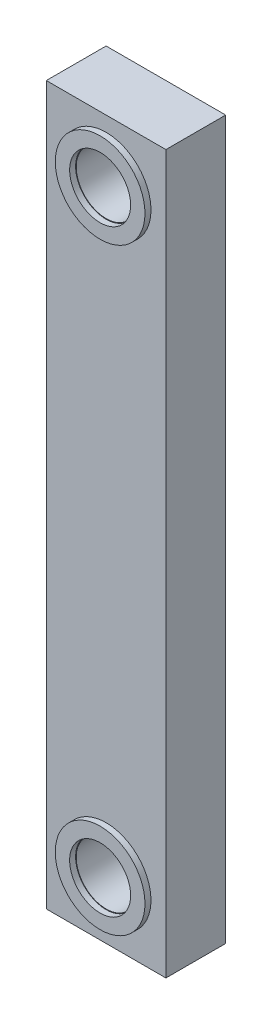
ISO-10303-21;
HEADER;
FILE_DESCRIPTION(('STEP AP214'),'2;1');
FILE_NAME('part.step','',(''),(''),'','','');
FILE_SCHEMA(('AUTOMOTIVE_DESIGN { 1 0 10303 214 1 1 1 1 }'));
ENDSEC;
DATA;
#1=APPLICATION_CONTEXT('core data for automotive mechanical design processes');
#2=APPLICATION_PROTOCOL_DEFINITION('international standard','automotive_design',2000,#1);
#3=PRODUCT_CONTEXT('',#1,'mechanical');
#4=PRODUCT('Part','Part','',(#3));
#5=PRODUCT_RELATED_PRODUCT_CATEGORY('part','',(#4));
#6=PRODUCT_DEFINITION_FORMATION('','',#4);
#7=PRODUCT_DEFINITION_CONTEXT('part definition',#1,'design');
#8=PRODUCT_DEFINITION('design','',#6,#7);
#9=PRODUCT_DEFINITION_SHAPE('','',#8);
#10=(LENGTH_UNIT() NAMED_UNIT(*) SI_UNIT(.MILLI.,.METRE.));
#11=(NAMED_UNIT(*) PLANE_ANGLE_UNIT() SI_UNIT($,.RADIAN.));
#12=(NAMED_UNIT(*) SI_UNIT($,.STERADIAN.) SOLID_ANGLE_UNIT());
#13=UNCERTAINTY_MEASURE_WITH_UNIT(LENGTH_MEASURE(1.E-05),#10,'distance_accuracy_value','');
#14=(GEOMETRIC_REPRESENTATION_CONTEXT(3) GLOBAL_UNCERTAINTY_ASSIGNED_CONTEXT((#13)) GLOBAL_UNIT_ASSIGNED_CONTEXT((#10,
#11,#12)) REPRESENTATION_CONTEXT('',''));
#15=CARTESIAN_POINT('',(0.,0.,0.));
#16=DIRECTION('',(0.,0.,1.));
#17=DIRECTION('',(1.,0.,0.));
#18=AXIS2_PLACEMENT_3D('',#15,#16,#17);
#19=CARTESIAN_POINT('',(0.,0.,10.));
#20=DIRECTION('',(1.,0.,0.));
#21=DIRECTION('',(0.,0.,-1.));
#22=AXIS2_PLACEMENT_3D('',#19,#20,#21);
#23=PLANE('',#22);
#24=DIRECTION('',(0.,-1.,0.));
#25=VECTOR('',#24,1.);
#26=CARTESIAN_POINT('',(0.,0.,0.));
#27=LINE('',#26,#25);
#28=CARTESIAN_POINT('',(0.,120.,0.));
#29=VERTEX_POINT('',#28);
#30=CARTESIAN_POINT('',(0.,0.,0.));
#31=VERTEX_POINT('',#30);
#32=EDGE_CURVE('E115',#29,#31,#27,.T.);
#33=ORIENTED_EDGE('',*,*,#32,.T.);
#34=DIRECTION('',(0.,0.,-1.));
#35=VECTOR('',#34,1.);
#36=CARTESIAN_POINT('',(0.,0.,10.));
#37=LINE('',#36,#35);
#38=CARTESIAN_POINT('',(0.,0.,10.));
#39=VERTEX_POINT('',#38);
#40=EDGE_CURVE('E104',#39,#31,#37,.T.);
#41=ORIENTED_EDGE('',*,*,#40,.F.);
#42=DIRECTION('',(0.,-1.,0.));
#43=VECTOR('',#42,1.);
#44=CARTESIAN_POINT('',(0.,0.,10.));
#45=LINE('',#44,#43);
#46=CARTESIAN_POINT('',(0.,120.,10.));
#47=VERTEX_POINT('',#46);
#48=EDGE_CURVE('E96',#47,#39,#45,.T.);
#49=ORIENTED_EDGE('',*,*,#48,.F.);
#50=DIRECTION('',(0.,0.,-1.));
#51=VECTOR('',#50,1.);
#52=CARTESIAN_POINT('',(0.,120.,10.));
#53=LINE('',#52,#51);
#54=EDGE_CURVE('E111',#47,#29,#53,.T.);
#55=ORIENTED_EDGE('',*,*,#54,.T.);
#56=EDGE_LOOP('',(#33,#41,#49,#55));
#57=FACE_BOUND('',#56,.T.);
#58=ADVANCED_FACE('F43',(#57),#23,.F.);
#59=CARTESIAN_POINT('',(0.,0.,10.));
#60=DIRECTION('',(0.,1.,0.));
#61=DIRECTION('',(0.,0.,1.));
#62=AXIS2_PLACEMENT_3D('',#59,#60,#61);
#63=PLANE('',#62);
#64=DIRECTION('',(1.,0.,0.));
#65=VECTOR('',#64,1.);
#66=CARTESIAN_POINT('',(0.,0.,0.));
#67=LINE('',#66,#65);
#68=CARTESIAN_POINT('',(20.,0.,0.));
#69=VERTEX_POINT('',#68);
#70=EDGE_CURVE('E102',#31,#69,#67,.T.);
#71=ORIENTED_EDGE('',*,*,#70,.T.);
#72=DIRECTION('',(0.,0.,-1.));
#73=VECTOR('',#72,1.);
#74=CARTESIAN_POINT('',(20.,0.,10.));
#75=LINE('',#74,#73);
#76=CARTESIAN_POINT('',(20.,0.,10.));
#77=VERTEX_POINT('',#76);
#78=EDGE_CURVE('E100',#77,#69,#75,.T.);
#79=ORIENTED_EDGE('',*,*,#78,.F.);
#80=DIRECTION('',(1.,0.,0.));
#81=VECTOR('',#80,1.);
#82=CARTESIAN_POINT('',(0.,0.,10.));
#83=LINE('',#82,#81);
#84=EDGE_CURVE('E91',#39,#77,#83,.T.);
#85=ORIENTED_EDGE('',*,*,#84,.F.);
#86=ORIENTED_EDGE('',*,*,#40,.T.);
#87=EDGE_LOOP('',(#71,#79,#85,#86));
#88=FACE_BOUND('',#87,.T.);
#89=ADVANCED_FACE('F101',(#88),#63,.F.);
#90=CARTESIAN_POINT('',(20.,0.,10.));
#91=DIRECTION('',(-1.,0.,0.));
#92=DIRECTION('',(0.,0.,1.));
#93=AXIS2_PLACEMENT_3D('',#90,#91,#92);
#94=PLANE('',#93);
#95=DIRECTION('',(0.,1.,0.));
#96=VECTOR('',#95,1.);
#97=CARTESIAN_POINT('',(20.,0.,0.));
#98=LINE('',#97,#96);
#99=CARTESIAN_POINT('',(20.,120.,0.));
#100=VERTEX_POINT('',#99);
#101=EDGE_CURVE('E77',#69,#100,#98,.T.);
#102=ORIENTED_EDGE('',*,*,#101,.T.);
#103=DIRECTION('',(0.,0.,-1.));
#104=VECTOR('',#103,1.);
#105=CARTESIAN_POINT('',(20.,120.,10.));
#106=LINE('',#105,#104);
#107=CARTESIAN_POINT('',(20.,120.,10.));
#108=VERTEX_POINT('',#107);
#109=EDGE_CURVE('E105',#108,#100,#106,.T.);
#110=ORIENTED_EDGE('',*,*,#109,.F.);
#111=DIRECTION('',(0.,1.,0.));
#112=VECTOR('',#111,1.);
#113=CARTESIAN_POINT('',(20.,0.,10.));
#114=LINE('',#113,#112);
#115=EDGE_CURVE('E94',#77,#108,#114,.T.);
#116=ORIENTED_EDGE('',*,*,#115,.F.);
#117=ORIENTED_EDGE('',*,*,#78,.T.);
#118=EDGE_LOOP('',(#102,#110,#116,#117));
#119=FACE_BOUND('',#118,.T.);
#120=ADVANCED_FACE('F107',(#119),#94,.F.);
#121=CARTESIAN_POINT('',(0.,120.,10.));
#122=DIRECTION('',(0.,-1.,0.));
#123=DIRECTION('',(0.,0.,-1.));
#124=AXIS2_PLACEMENT_3D('',#121,#122,#123);
#125=PLANE('',#124);
#126=DIRECTION('',(-1.,0.,0.));
#127=VECTOR('',#126,1.);
#128=CARTESIAN_POINT('',(0.,120.,0.));
#129=LINE('',#128,#127);
#130=EDGE_CURVE('E83',#100,#29,#129,.T.);
#131=ORIENTED_EDGE('',*,*,#130,.T.);
#132=ORIENTED_EDGE('',*,*,#54,.F.);
#133=DIRECTION('',(-1.,0.,0.));
#134=VECTOR('',#133,1.);
#135=CARTESIAN_POINT('',(0.,120.,10.));
#136=LINE('',#135,#134);
#137=EDGE_CURVE('E60',#108,#47,#136,.T.);
#138=ORIENTED_EDGE('',*,*,#137,.F.);
#139=ORIENTED_EDGE('',*,*,#109,.T.);
#140=EDGE_LOOP('',(#131,#132,#138,#139));
#141=FACE_BOUND('',#140,.T.);
#142=ADVANCED_FACE('F139',(#141),#125,.F.);
#143=CARTESIAN_POINT('',(0.,0.,10.));
#144=DIRECTION('',(0.,0.,-1.));
#145=DIRECTION('',(-1.,0.,0.));
#146=AXIS2_PLACEMENT_3D('',#143,#144,#145);
#147=PLANE('',#146);
#148=CARTESIAN_POINT('',(10.,10.,10.));
#149=DIRECTION('',(0.,0.,-1.));
#150=DIRECTION('',(-1.,0.,0.));
#151=AXIS2_PLACEMENT_3D('',#148,#149,#150);
#152=CIRCLE('',#151,7.5);
#153=CARTESIAN_POINT('',(2.5,10.,10.));
#154=VERTEX_POINT('',#153);
#155=EDGE_CURVE('E11',#154,#154,#152,.F.);
#156=ORIENTED_EDGE('',*,*,#155,.F.);
#157=EDGE_LOOP('',(#156));
#158=FACE_BOUND('',#157,.T.);
#159=CARTESIAN_POINT('',(10.,110.,10.));
#160=DIRECTION('',(0.,0.,-1.));
#161=DIRECTION('',(-1.,0.,0.));
#162=AXIS2_PLACEMENT_3D('',#159,#160,#161);
#163=CIRCLE('',#162,7.5);
#164=CARTESIAN_POINT('',(2.5,110.,10.));
#165=VERTEX_POINT('',#164);
#166=EDGE_CURVE('E52',#165,#165,#163,.F.);
#167=ORIENTED_EDGE('',*,*,#166,.F.);
#168=EDGE_LOOP('',(#167));
#169=FACE_BOUND('',#168,.T.);
#170=ORIENTED_EDGE('',*,*,#48,.T.);
#171=ORIENTED_EDGE('',*,*,#84,.T.);
#172=ORIENTED_EDGE('',*,*,#115,.T.);
#173=ORIENTED_EDGE('',*,*,#137,.T.);
#174=EDGE_LOOP('',(#170,#171,#172,#173));
#175=FACE_BOUND('',#174,.T.);
#176=ADVANCED_FACE('F92',(#158,#169,#175),#147,.F.);
#177=CARTESIAN_POINT('',(0.,0.,0.));
#178=DIRECTION('',(0.,0.,-1.));
#179=DIRECTION('',(-1.,0.,0.));
#180=AXIS2_PLACEMENT_3D('',#177,#178,#179);
#181=PLANE('',#180);
#182=CARTESIAN_POINT('',(10.,110.,0.));
#183=DIRECTION('',(0.,0.,1.));
#184=DIRECTION('',(1.,0.,0.));
#185=AXIS2_PLACEMENT_3D('',#182,#183,#184);
#186=CIRCLE('',#185,5.00000000000001);
#187=CARTESIAN_POINT('',(15.,110.,0.));
#188=VERTEX_POINT('',#187);
#189=EDGE_CURVE('E194',#188,#188,#186,.T.);
#190=ORIENTED_EDGE('',*,*,#189,.T.);
#191=EDGE_LOOP('',(#190));
#192=FACE_BOUND('',#191,.T.);
#193=CARTESIAN_POINT('',(10.,10.,0.));
#194=DIRECTION('',(0.,0.,1.));
#195=DIRECTION('',(1.,0.,0.));
#196=AXIS2_PLACEMENT_3D('',#193,#194,#195);
#197=CIRCLE('',#196,5.);
#198=CARTESIAN_POINT('',(15.,10.,0.));
#199=VERTEX_POINT('',#198);
#200=EDGE_CURVE('E195',#199,#199,#197,.T.);
#201=ORIENTED_EDGE('',*,*,#200,.T.);
#202=EDGE_LOOP('',(#201));
#203=FACE_BOUND('',#202,.T.);
#204=ORIENTED_EDGE('',*,*,#32,.F.);
#205=ORIENTED_EDGE('',*,*,#130,.F.);
#206=ORIENTED_EDGE('',*,*,#101,.F.);
#207=ORIENTED_EDGE('',*,*,#70,.F.);
#208=EDGE_LOOP('',(#204,#205,#206,#207));
#209=FACE_BOUND('',#208,.T.);
#210=ADVANCED_FACE('F138',(#192,#203,#209),#181,.T.);
#211=CARTESIAN_POINT('',(10.,110.,11.));
#212=DIRECTION('',(0.,0.,1.));
#213=DIRECTION('',(1.,0.,0.));
#214=AXIS2_PLACEMENT_3D('',#211,#212,#213);
#215=PLANE('',#214);
#216=CARTESIAN_POINT('',(10.,110.,11.));
#217=DIRECTION('',(0.,0.,1.));
#218=DIRECTION('',(1.,0.,0.));
#219=AXIS2_PLACEMENT_3D('',#216,#217,#218);
#220=CIRCLE('',#219,7.5);
#221=CARTESIAN_POINT('',(17.5,110.,11.));
#222=VERTEX_POINT('',#221);
#223=EDGE_CURVE('E119',#222,#222,#220,.T.);
#224=ORIENTED_EDGE('',*,*,#223,.T.);
#225=EDGE_LOOP('',(#224));
#226=FACE_BOUND('',#225,.T.);
#227=CARTESIAN_POINT('',(10.,110.,11.));
#228=DIRECTION('',(0.,0.,1.));
#229=DIRECTION('',(1.,0.,0.));
#230=AXIS2_PLACEMENT_3D('',#227,#228,#229);
#231=CIRCLE('',#230,5.1);
#232=CARTESIAN_POINT('',(15.1,110.,11.));
#233=VERTEX_POINT('',#232);
#234=EDGE_CURVE('E174',#233,#233,#231,.T.);
#235=ORIENTED_EDGE('',*,*,#234,.F.);
#236=EDGE_LOOP('',(#235));
#237=FACE_BOUND('',#236,.T.);
#238=ADVANCED_FACE('F148',(#226,#237),#215,.T.);
#239=CARTESIAN_POINT('',(10.,110.,11.));
#240=DIRECTION('',(0.,0.,-1.));
#241=DIRECTION('',(-1.,0.,0.));
#242=AXIS2_PLACEMENT_3D('',#239,#240,#241);
#243=CYLINDRICAL_SURFACE('',#242,7.5);
#244=ORIENTED_EDGE('',*,*,#223,.F.);
#245=EDGE_LOOP('',(#244));
#246=FACE_BOUND('',#245,.T.);
#247=ORIENTED_EDGE('',*,*,#166,.T.);
#248=EDGE_LOOP('',(#247));
#249=FACE_BOUND('',#248,.T.);
#250=ADVANCED_FACE('F135',(#246,#249),#243,.T.);
#251=CARTESIAN_POINT('',(10.,110.,11.));
#252=DIRECTION('',(0.,0.,-1.));
#253=DIRECTION('',(-1.,0.,0.));
#254=AXIS2_PLACEMENT_3D('',#251,#252,#253);
#255=CYLINDRICAL_SURFACE('',#254,5.1);
#256=ORIENTED_EDGE('',*,*,#234,.T.);
#257=EDGE_LOOP('',(#256));
#258=FACE_BOUND('',#257,.T.);
#259=CARTESIAN_POINT('',(10.,110.,10.));
#260=DIRECTION('',(0.,0.,1.));
#261=DIRECTION('',(1.,0.,0.));
#262=AXIS2_PLACEMENT_3D('',#259,#260,#261);
#263=CIRCLE('',#262,5.1);
#264=CARTESIAN_POINT('',(15.1,110.,10.));
#265=VERTEX_POINT('',#264);
#266=EDGE_CURVE('E175',#265,#265,#263,.T.);
#267=ORIENTED_EDGE('',*,*,#266,.F.);
#268=EDGE_LOOP('',(#267));
#269=FACE_BOUND('',#268,.T.);
#270=ADVANCED_FACE('F160',(#258,#269),#255,.F.);
#271=CARTESIAN_POINT('',(10.,110.,10.));
#272=DIRECTION('',(0.,0.,1.));
#273=DIRECTION('',(1.,0.,0.));
#274=AXIS2_PLACEMENT_3D('',#271,#272,#273);
#275=CIRCLE('',#274,5.00000000000001);
#276=CARTESIAN_POINT('',(15.,110.,10.));
#277=VERTEX_POINT('',#276);
#278=EDGE_CURVE('E203',#277,#277,#275,.T.);
#279=ORIENTED_EDGE('',*,*,#278,.F.);
#280=EDGE_LOOP('',(#279));
#281=FACE_BOUND('',#280,.T.);
#282=ORIENTED_EDGE('',*,*,#266,.T.);
#283=EDGE_LOOP('',(#282));
#284=FACE_BOUND('',#283,.T.);
#285=ADVANCED_FACE('F143',(#281,#284),#147,.F.);
#286=CARTESIAN_POINT('',(10.,10.,11.));
#287=DIRECTION('',(0.,0.,1.));
#288=DIRECTION('',(1.,0.,0.));
#289=AXIS2_PLACEMENT_3D('',#286,#287,#288);
#290=PLANE('',#289);
#291=CARTESIAN_POINT('',(10.,10.,11.));
#292=DIRECTION('',(0.,0.,1.));
#293=DIRECTION('',(1.,0.,0.));
#294=AXIS2_PLACEMENT_3D('',#291,#292,#293);
#295=CIRCLE('',#294,7.5);
#296=CARTESIAN_POINT('',(17.5,10.,11.));
#297=VERTEX_POINT('',#296);
#298=EDGE_CURVE('E187',#297,#297,#295,.T.);
#299=ORIENTED_EDGE('',*,*,#298,.T.);
#300=EDGE_LOOP('',(#299));
#301=FACE_BOUND('',#300,.T.);
#302=CARTESIAN_POINT('',(10.,10.,11.));
#303=DIRECTION('',(0.,0.,1.));
#304=DIRECTION('',(1.,0.,0.));
#305=AXIS2_PLACEMENT_3D('',#302,#303,#304);
#306=CIRCLE('',#305,5.1);
#307=CARTESIAN_POINT('',(15.1,10.,11.));
#308=VERTEX_POINT('',#307);
#309=EDGE_CURVE('E183',#308,#308,#306,.T.);
#310=ORIENTED_EDGE('',*,*,#309,.F.);
#311=EDGE_LOOP('',(#310));
#312=FACE_BOUND('',#311,.T.);
#313=ADVANCED_FACE('F159',(#301,#312),#290,.T.);
#314=CARTESIAN_POINT('',(10.,10.,11.));
#315=DIRECTION('',(0.,0.,-1.));
#316=DIRECTION('',(-1.,0.,0.));
#317=AXIS2_PLACEMENT_3D('',#314,#315,#316);
#318=CYLINDRICAL_SURFACE('',#317,7.5);
#319=ORIENTED_EDGE('',*,*,#298,.F.);
#320=EDGE_LOOP('',(#319));
#321=FACE_BOUND('',#320,.T.);
#322=ORIENTED_EDGE('',*,*,#155,.T.);
#323=EDGE_LOOP('',(#322));
#324=FACE_BOUND('',#323,.T.);
#325=ADVANCED_FACE('F258',(#321,#324),#318,.T.);
#326=CARTESIAN_POINT('',(10.,10.,11.));
#327=DIRECTION('',(0.,0.,-1.));
#328=DIRECTION('',(-1.,0.,0.));
#329=AXIS2_PLACEMENT_3D('',#326,#327,#328);
#330=CYLINDRICAL_SURFACE('',#329,5.1);
#331=ORIENTED_EDGE('',*,*,#309,.T.);
#332=EDGE_LOOP('',(#331));
#333=FACE_BOUND('',#332,.T.);
#334=CARTESIAN_POINT('',(10.,10.,10.));
#335=DIRECTION('',(0.,0.,1.));
#336=DIRECTION('',(1.,0.,0.));
#337=AXIS2_PLACEMENT_3D('',#334,#335,#336);
#338=CIRCLE('',#337,5.1);
#339=CARTESIAN_POINT('',(15.1,10.,10.));
#340=VERTEX_POINT('',#339);
#341=EDGE_CURVE('E179',#340,#340,#338,.T.);
#342=ORIENTED_EDGE('',*,*,#341,.F.);
#343=EDGE_LOOP('',(#342));
#344=FACE_BOUND('',#343,.T.);
#345=ADVANCED_FACE('F156',(#333,#344),#330,.F.);
#346=CARTESIAN_POINT('',(10.,10.,10.));
#347=DIRECTION('',(0.,0.,1.));
#348=DIRECTION('',(1.,0.,0.));
#349=AXIS2_PLACEMENT_3D('',#346,#347,#348);
#350=CIRCLE('',#349,5.);
#351=CARTESIAN_POINT('',(15.,10.,10.));
#352=VERTEX_POINT('',#351);
#353=EDGE_CURVE('E199',#352,#352,#350,.T.);
#354=ORIENTED_EDGE('',*,*,#353,.F.);
#355=EDGE_LOOP('',(#354));
#356=FACE_BOUND('',#355,.T.);
#357=ORIENTED_EDGE('',*,*,#341,.T.);
#358=EDGE_LOOP('',(#357));
#359=FACE_BOUND('',#358,.T.);
#360=ADVANCED_FACE('F142',(#356,#359),#147,.F.);
#361=CARTESIAN_POINT('',(10.,10.,0.));
#362=DIRECTION('',(0.,0.,1.));
#363=DIRECTION('',(1.,0.,0.));
#364=AXIS2_PLACEMENT_3D('',#361,#362,#363);
#365=CYLINDRICAL_SURFACE('',#364,5.);
#366=ORIENTED_EDGE('',*,*,#200,.F.);
#367=EDGE_LOOP('',(#366));
#368=FACE_BOUND('',#367,.T.);
#369=ORIENTED_EDGE('',*,*,#353,.T.);
#370=EDGE_LOOP('',(#369));
#371=FACE_BOUND('',#370,.T.);
#372=ADVANCED_FACE('F155',(#368,#371),#365,.F.);
#373=CARTESIAN_POINT('',(10.,110.,0.));
#374=DIRECTION('',(0.,0.,1.));
#375=DIRECTION('',(1.,0.,0.));
#376=AXIS2_PLACEMENT_3D('',#373,#374,#375);
#377=CYLINDRICAL_SURFACE('',#376,5.00000000000001);
#378=ORIENTED_EDGE('',*,*,#189,.F.);
#379=EDGE_LOOP('',(#378));
#380=FACE_BOUND('',#379,.T.);
#381=ORIENTED_EDGE('',*,*,#278,.T.);
#382=EDGE_LOOP('',(#381));
#383=FACE_BOUND('',#382,.T.);
#384=ADVANCED_FACE('F212',(#380,#383),#377,.F.);
#385=CLOSED_SHELL('',(#58,#89,#120,#142,#176,#210,#238,#250,#270,#285,#313,#325,#345,#360,#372,#384));
#386=MANIFOLD_SOLID_BREP('B2',#385);
#387=ADVANCED_BREP_SHAPE_REPRESENTATION('',(#18,#386),#14);
#388=SHAPE_DEFINITION_REPRESENTATION(#9,#387);
ENDSEC;
END-ISO-10303-21;
